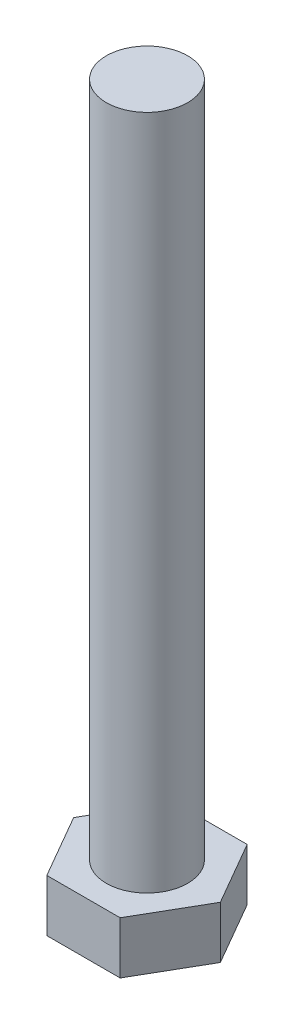
ISO-10303-21;
HEADER;
FILE_DESCRIPTION(('STEP AP214'),'2;1');
FILE_NAME('part.step','',(''),(''),'','','');
FILE_SCHEMA(('AUTOMOTIVE_DESIGN { 1 0 10303 214 1 1 1 1 }'));
ENDSEC;
DATA;
#1=APPLICATION_CONTEXT('core data for automotive mechanical design processes');
#2=APPLICATION_PROTOCOL_DEFINITION('international standard','automotive_design',2000,#1);
#3=PRODUCT_CONTEXT('',#1,'mechanical');
#4=PRODUCT('Part','Part','',(#3));
#5=PRODUCT_RELATED_PRODUCT_CATEGORY('part','',(#4));
#6=PRODUCT_DEFINITION_FORMATION('','',#4);
#7=PRODUCT_DEFINITION_CONTEXT('part definition',#1,'design');
#8=PRODUCT_DEFINITION('design','',#6,#7);
#9=PRODUCT_DEFINITION_SHAPE('','',#8);
#10=(LENGTH_UNIT() NAMED_UNIT(*) SI_UNIT(.MILLI.,.METRE.));
#11=(NAMED_UNIT(*) PLANE_ANGLE_UNIT() SI_UNIT($,.RADIAN.));
#12=(NAMED_UNIT(*) SI_UNIT($,.STERADIAN.) SOLID_ANGLE_UNIT());
#13=UNCERTAINTY_MEASURE_WITH_UNIT(LENGTH_MEASURE(1.E-05),#10,'distance_accuracy_value','');
#14=(GEOMETRIC_REPRESENTATION_CONTEXT(3) GLOBAL_UNCERTAINTY_ASSIGNED_CONTEXT((#13)) GLOBAL_UNIT_ASSIGNED_CONTEXT((#10,
#11,#12)) REPRESENTATION_CONTEXT('',''));
#15=CARTESIAN_POINT('',(0.,0.,0.));
#16=DIRECTION('',(0.,0.,1.));
#17=DIRECTION('',(1.,0.,0.));
#18=AXIS2_PLACEMENT_3D('',#15,#16,#17);
#19=CARTESIAN_POINT('',(-5.41265877365284,7.7,-9.37499999999993));
#20=DIRECTION('',(0.866025403784441,0.,0.499999999999995));
#21=DIRECTION('',(0.499999999999995,0.,-0.866025403784441));
#22=AXIS2_PLACEMENT_3D('',#19,#20,#21);
#23=PLANE('',#22);
#24=DIRECTION('',(-0.499999999999995,0.,0.866025403784441));
#25=VECTOR('',#24,1.);
#26=CARTESIAN_POINT('',(-5.41265877365284,0.,-9.37499999999993));
#27=LINE('',#26,#25);
#28=CARTESIAN_POINT('',(-5.41265877365284,0.,-9.37499999999993));
#29=VERTEX_POINT('',#28);
#30=CARTESIAN_POINT('',(-10.8253175473055,0.,0.));
#31=VERTEX_POINT('',#30);
#32=EDGE_CURVE('E136',#29,#31,#27,.T.);
#33=ORIENTED_EDGE('',*,*,#32,.T.);
#34=DIRECTION('',(0.,-1.,0.));
#35=VECTOR('',#34,1.);
#36=CARTESIAN_POINT('',(-10.8253175473055,7.7,0.));
#37=LINE('',#36,#35);
#38=CARTESIAN_POINT('',(-10.8253175473055,7.7,0.));
#39=VERTEX_POINT('',#38);
#40=EDGE_CURVE('E48',#39,#31,#37,.T.);
#41=ORIENTED_EDGE('',*,*,#40,.F.);
#42=DIRECTION('',(-0.499999999999995,0.,0.866025403784441));
#43=VECTOR('',#42,1.);
#44=CARTESIAN_POINT('',(-5.41265877365284,7.7,-9.37499999999993));
#45=LINE('',#44,#43);
#46=CARTESIAN_POINT('',(-5.41265877365284,7.7,-9.37499999999993));
#47=VERTEX_POINT('',#46);
#48=EDGE_CURVE('E153',#47,#39,#45,.T.);
#49=ORIENTED_EDGE('',*,*,#48,.F.);
#50=DIRECTION('',(0.,-1.,0.));
#51=VECTOR('',#50,1.);
#52=CARTESIAN_POINT('',(-5.41265877365284,7.7,-9.37499999999993));
#53=LINE('',#52,#51);
#54=EDGE_CURVE('E132',#47,#29,#53,.T.);
#55=ORIENTED_EDGE('',*,*,#54,.T.);
#56=EDGE_LOOP('',(#33,#41,#49,#55));
#57=FACE_BOUND('',#56,.T.);
#58=ADVANCED_FACE('F45',(#57),#23,.F.);
#59=CARTESIAN_POINT('',(-10.8253175473055,7.7,0.));
#60=DIRECTION('',(0.866025403784438,0.,-0.500000000000001));
#61=DIRECTION('',(-0.500000000000001,0.,-0.866025403784438));
#62=AXIS2_PLACEMENT_3D('',#59,#60,#61);
#63=PLANE('',#62);
#64=DIRECTION('',(0.500000000000001,0.,0.866025403784438));
#65=VECTOR('',#64,1.);
#66=CARTESIAN_POINT('',(-10.8253175473055,0.,0.));
#67=LINE('',#66,#65);
#68=CARTESIAN_POINT('',(-5.41265877365271,0.,9.375));
#69=VERTEX_POINT('',#68);
#70=EDGE_CURVE('E140',#31,#69,#67,.T.);
#71=ORIENTED_EDGE('',*,*,#70,.T.);
#72=DIRECTION('',(0.,-1.,0.));
#73=VECTOR('',#72,1.);
#74=CARTESIAN_POINT('',(-5.41265877365271,7.7,9.375));
#75=LINE('',#74,#73);
#76=CARTESIAN_POINT('',(-5.41265877365271,7.7,9.375));
#77=VERTEX_POINT('',#76);
#78=EDGE_CURVE('E159',#77,#69,#75,.T.);
#79=ORIENTED_EDGE('',*,*,#78,.F.);
#80=DIRECTION('',(0.500000000000001,0.,0.866025403784438));
#81=VECTOR('',#80,1.);
#82=CARTESIAN_POINT('',(-10.8253175473055,7.7,0.));
#83=LINE('',#82,#81);
#84=EDGE_CURVE('E101',#39,#77,#83,.T.);
#85=ORIENTED_EDGE('',*,*,#84,.F.);
#86=ORIENTED_EDGE('',*,*,#40,.T.);
#87=EDGE_LOOP('',(#71,#79,#85,#86));
#88=FACE_BOUND('',#87,.T.);
#89=ADVANCED_FACE('F166',(#88),#63,.F.);
#90=CARTESIAN_POINT('',(-5.41265877365271,7.7,9.375));
#91=DIRECTION('',(0.,0.,-1.));
#92=DIRECTION('',(-1.,0.,0.));
#93=AXIS2_PLACEMENT_3D('',#90,#91,#92);
#94=PLANE('',#93);
#95=DIRECTION('',(1.,0.,0.));
#96=VECTOR('',#95,1.);
#97=CARTESIAN_POINT('',(-5.41265877365271,0.,9.375));
#98=LINE('',#97,#96);
#99=CARTESIAN_POINT('',(5.41265877365278,0.,9.37499999999996));
#100=VERTEX_POINT('',#99);
#101=EDGE_CURVE('E144',#69,#100,#98,.T.);
#102=ORIENTED_EDGE('',*,*,#101,.T.);
#103=DIRECTION('',(0.,-1.,0.));
#104=VECTOR('',#103,1.);
#105=CARTESIAN_POINT('',(5.41265877365278,7.7,9.37499999999996));
#106=LINE('',#105,#104);
#107=CARTESIAN_POINT('',(5.41265877365278,7.7,9.37499999999996));
#108=VERTEX_POINT('',#107);
#109=EDGE_CURVE('E125',#108,#100,#106,.T.);
#110=ORIENTED_EDGE('',*,*,#109,.F.);
#111=DIRECTION('',(1.,0.,0.));
#112=VECTOR('',#111,1.);
#113=CARTESIAN_POINT('',(-5.41265877365271,7.7,9.375));
#114=LINE('',#113,#112);
#115=EDGE_CURVE('E114',#77,#108,#114,.T.);
#116=ORIENTED_EDGE('',*,*,#115,.F.);
#117=ORIENTED_EDGE('',*,*,#78,.T.);
#118=EDGE_LOOP('',(#102,#110,#116,#117));
#119=FACE_BOUND('',#118,.T.);
#120=ADVANCED_FACE('F172',(#119),#94,.F.);
#121=CARTESIAN_POINT('',(5.41265877365278,7.7,9.37499999999996));
#122=DIRECTION('',(-0.866025403784442,0.,-0.499999999999995));
#123=DIRECTION('',(-0.499999999999995,0.,0.866025403784442));
#124=AXIS2_PLACEMENT_3D('',#121,#122,#123);
#125=PLANE('',#124);
#126=DIRECTION('',(0.499999999999995,0.,-0.866025403784441));
#127=VECTOR('',#126,1.);
#128=CARTESIAN_POINT('',(5.41265877365278,0.,9.37499999999996));
#129=LINE('',#128,#127);
#130=CARTESIAN_POINT('',(10.8253175473055,0.,0.));
#131=VERTEX_POINT('',#130);
#132=EDGE_CURVE('E123',#100,#131,#129,.T.);
#133=ORIENTED_EDGE('',*,*,#132,.T.);
#134=DIRECTION('',(0.,-1.,0.));
#135=VECTOR('',#134,1.);
#136=CARTESIAN_POINT('',(10.8253175473055,7.7,0.));
#137=LINE('',#136,#135);
#138=CARTESIAN_POINT('',(10.8253175473055,7.7,0.));
#139=VERTEX_POINT('',#138);
#140=EDGE_CURVE('E120',#139,#131,#137,.T.);
#141=ORIENTED_EDGE('',*,*,#140,.F.);
#142=DIRECTION('',(0.499999999999995,0.,-0.866025403784441));
#143=VECTOR('',#142,1.);
#144=CARTESIAN_POINT('',(5.41265877365278,7.7,9.37499999999996));
#145=LINE('',#144,#143);
#146=EDGE_CURVE('E108',#108,#139,#145,.T.);
#147=ORIENTED_EDGE('',*,*,#146,.F.);
#148=ORIENTED_EDGE('',*,*,#109,.T.);
#149=EDGE_LOOP('',(#133,#141,#147,#148));
#150=FACE_BOUND('',#149,.T.);
#151=ADVANCED_FACE('F121',(#150),#125,.F.);
#152=CARTESIAN_POINT('',(10.8253175473055,7.7,0.));
#153=DIRECTION('',(-0.866025403784435,0.,0.500000000000007));
#154=DIRECTION('',(0.500000000000007,0.,0.866025403784434));
#155=AXIS2_PLACEMENT_3D('',#152,#153,#154);
#156=PLANE('',#155);
#157=DIRECTION('',(-0.500000000000007,0.,-0.866025403784434));
#158=VECTOR('',#157,1.);
#159=CARTESIAN_POINT('',(10.8253175473055,0.,0.));
#160=LINE('',#159,#158);
#161=CARTESIAN_POINT('',(5.41265877365265,0.,-9.37500000000004));
#162=VERTEX_POINT('',#161);
#163=EDGE_CURVE('E86',#131,#162,#160,.T.);
#164=ORIENTED_EDGE('',*,*,#163,.T.);
#165=DIRECTION('',(0.,-1.,0.));
#166=VECTOR('',#165,1.);
#167=CARTESIAN_POINT('',(5.41265877365265,7.7,-9.37500000000004));
#168=LINE('',#167,#166);
#169=CARTESIAN_POINT('',(5.41265877365265,7.7,-9.37500000000004));
#170=VERTEX_POINT('',#169);
#171=EDGE_CURVE('E126',#170,#162,#168,.T.);
#172=ORIENTED_EDGE('',*,*,#171,.F.);
#173=DIRECTION('',(-0.500000000000007,0.,-0.866025403784434));
#174=VECTOR('',#173,1.);
#175=CARTESIAN_POINT('',(10.8253175473055,7.7,0.));
#176=LINE('',#175,#174);
#177=EDGE_CURVE('E112',#139,#170,#176,.T.);
#178=ORIENTED_EDGE('',*,*,#177,.F.);
#179=ORIENTED_EDGE('',*,*,#140,.T.);
#180=EDGE_LOOP('',(#164,#172,#178,#179));
#181=FACE_BOUND('',#180,.T.);
#182=ADVANCED_FACE('F128',(#181),#156,.F.);
#183=CARTESIAN_POINT('',(5.41265877365265,7.7,-9.37500000000004));
#184=DIRECTION('',(0.,0.,1.));
#185=DIRECTION('',(1.,0.,0.));
#186=AXIS2_PLACEMENT_3D('',#183,#184,#185);
#187=PLANE('',#186);
#188=DIRECTION('',(-1.,0.,0.));
#189=VECTOR('',#188,1.);
#190=CARTESIAN_POINT('',(5.41265877365265,0.,-9.37500000000004));
#191=LINE('',#190,#189);
#192=EDGE_CURVE('E92',#162,#29,#191,.T.);
#193=ORIENTED_EDGE('',*,*,#192,.T.);
#194=ORIENTED_EDGE('',*,*,#54,.F.);
#195=DIRECTION('',(-1.,0.,0.));
#196=VECTOR('',#195,1.);
#197=CARTESIAN_POINT('',(5.41265877365265,7.7,-9.37500000000004));
#198=LINE('',#197,#196);
#199=EDGE_CURVE('E63',#170,#47,#198,.T.);
#200=ORIENTED_EDGE('',*,*,#199,.F.);
#201=ORIENTED_EDGE('',*,*,#171,.T.);
#202=EDGE_LOOP('',(#193,#194,#200,#201));
#203=FACE_BOUND('',#202,.T.);
#204=ADVANCED_FACE('F192',(#203),#187,.F.);
#205=CARTESIAN_POINT('',(0.,7.7,0.));
#206=DIRECTION('',(0.,1.,0.));
#207=DIRECTION('',(0.,0.,1.));
#208=AXIS2_PLACEMENT_3D('',#205,#206,#207);
#209=PLANE('',#208);
#210=CARTESIAN_POINT('',(0.,7.7,0.));
#211=DIRECTION('',(0.,1.,0.));
#212=DIRECTION('',(0.,0.,1.));
#213=AXIS2_PLACEMENT_3D('',#210,#211,#212);
#214=CIRCLE('',#213,6.);
#215=CARTESIAN_POINT('',(0.,7.7,6.));
#216=VERTEX_POINT('',#215);
#217=EDGE_CURVE('E11',#216,#216,#214,.T.);
#218=ORIENTED_EDGE('',*,*,#217,.F.);
#219=EDGE_LOOP('',(#218));
#220=FACE_BOUND('',#219,.T.);
#221=ORIENTED_EDGE('',*,*,#48,.T.);
#222=ORIENTED_EDGE('',*,*,#84,.T.);
#223=ORIENTED_EDGE('',*,*,#115,.T.);
#224=ORIENTED_EDGE('',*,*,#146,.T.);
#225=ORIENTED_EDGE('',*,*,#177,.T.);
#226=ORIENTED_EDGE('',*,*,#199,.T.);
#227=EDGE_LOOP('',(#221,#222,#223,#224,#225,#226));
#228=FACE_BOUND('',#227,.T.);
#229=ADVANCED_FACE('F110',(#220,#228),#209,.T.);
#230=CARTESIAN_POINT('',(0.,0.,0.));
#231=DIRECTION('',(0.,1.,0.));
#232=DIRECTION('',(0.,0.,1.));
#233=AXIS2_PLACEMENT_3D('',#230,#231,#232);
#234=PLANE('',#233);
#235=ORIENTED_EDGE('',*,*,#32,.F.);
#236=ORIENTED_EDGE('',*,*,#192,.F.);
#237=ORIENTED_EDGE('',*,*,#163,.F.);
#238=ORIENTED_EDGE('',*,*,#132,.F.);
#239=ORIENTED_EDGE('',*,*,#101,.F.);
#240=ORIENTED_EDGE('',*,*,#70,.F.);
#241=EDGE_LOOP('',(#235,#236,#237,#238,#239,#240));
#242=FACE_BOUND('',#241,.T.);
#243=ADVANCED_FACE('F171',(#242),#234,.F.);
#244=CARTESIAN_POINT('',(0.,107.5,0.));
#245=DIRECTION('',(0.,-1.,0.));
#246=DIRECTION('',(0.,0.,-1.));
#247=AXIS2_PLACEMENT_3D('',#244,#245,#246);
#248=CYLINDRICAL_SURFACE('',#247,6.);
#249=CARTESIAN_POINT('',(0.,107.5,0.));
#250=DIRECTION('',(0.,1.,0.));
#251=DIRECTION('',(0.,0.,1.));
#252=AXIS2_PLACEMENT_3D('',#249,#250,#251);
#253=CIRCLE('',#252,6.);
#254=CARTESIAN_POINT('',(0.,107.5,6.));
#255=VERTEX_POINT('',#254);
#256=EDGE_CURVE('E141',#255,#255,#253,.T.);
#257=ORIENTED_EDGE('',*,*,#256,.F.);
#258=EDGE_LOOP('',(#257));
#259=FACE_BOUND('',#258,.T.);
#260=ORIENTED_EDGE('',*,*,#217,.T.);
#261=EDGE_LOOP('',(#260));
#262=FACE_BOUND('',#261,.T.);
#263=ADVANCED_FACE('F185',(#259,#262),#248,.T.);
#264=CARTESIAN_POINT('',(0.,107.5,0.));
#265=DIRECTION('',(0.,1.,0.));
#266=DIRECTION('',(0.,0.,1.));
#267=AXIS2_PLACEMENT_3D('',#264,#265,#266);
#268=PLANE('',#267);
#269=ORIENTED_EDGE('',*,*,#256,.T.);
#270=EDGE_LOOP('',(#269));
#271=FACE_BOUND('',#270,.T.);
#272=ADVANCED_FACE('F183',(#271),#268,.T.);
#273=CLOSED_SHELL('',(#58,#89,#120,#151,#182,#204,#229,#243,#263,#272));
#274=MANIFOLD_SOLID_BREP('B2',#273);
#275=ADVANCED_BREP_SHAPE_REPRESENTATION('',(#18,#274),#14);
#276=SHAPE_DEFINITION_REPRESENTATION(#9,#275);
ENDSEC;
END-ISO-10303-21;
